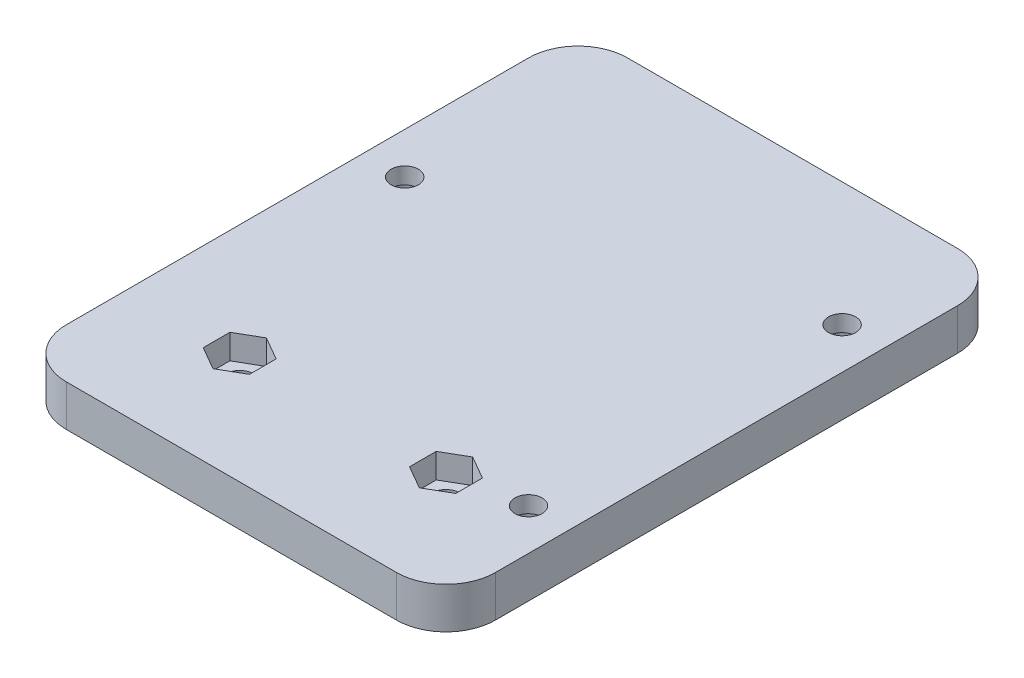
ISO-10303-21;
HEADER;
FILE_DESCRIPTION(('STEP AP214'),'2;1');
FILE_NAME('part.step','',(''),(''),'','','');
FILE_SCHEMA(('AUTOMOTIVE_DESIGN { 1 0 10303 214 1 1 1 1 }'));
ENDSEC;
DATA;
#1=APPLICATION_CONTEXT('core data for automotive mechanical design processes');
#2=APPLICATION_PROTOCOL_DEFINITION('international standard','automotive_design',2000,#1);
#3=PRODUCT_CONTEXT('',#1,'mechanical');
#4=PRODUCT('Part','Part','',(#3));
#5=PRODUCT_RELATED_PRODUCT_CATEGORY('part','',(#4));
#6=PRODUCT_DEFINITION_FORMATION('','',#4);
#7=PRODUCT_DEFINITION_CONTEXT('part definition',#1,'design');
#8=PRODUCT_DEFINITION('design','',#6,#7);
#9=PRODUCT_DEFINITION_SHAPE('','',#8);
#10=(LENGTH_UNIT() NAMED_UNIT(*) SI_UNIT(.MILLI.,.METRE.));
#11=(NAMED_UNIT(*) PLANE_ANGLE_UNIT() SI_UNIT($,.RADIAN.));
#12=(NAMED_UNIT(*) SI_UNIT($,.STERADIAN.) SOLID_ANGLE_UNIT());
#13=UNCERTAINTY_MEASURE_WITH_UNIT(LENGTH_MEASURE(1.E-05),#10,'distance_accuracy_value','');
#14=(GEOMETRIC_REPRESENTATION_CONTEXT(3) GLOBAL_UNCERTAINTY_ASSIGNED_CONTEXT((#13)) GLOBAL_UNIT_ASSIGNED_CONTEXT((#10,
#11,#12)) REPRESENTATION_CONTEXT('',''));
#15=CARTESIAN_POINT('',(0.,0.,0.));
#16=DIRECTION('',(0.,0.,1.));
#17=DIRECTION('',(1.,0.,0.));
#18=AXIS2_PLACEMENT_3D('',#15,#16,#17);
#19=CARTESIAN_POINT('',(10.5,-74.498,190.));
#20=DIRECTION('',(0.,-1.,0.));
#21=DIRECTION('',(0.,0.,-1.));
#22=AXIS2_PLACEMENT_3D('',#19,#20,#21);
#23=CYLINDRICAL_SURFACE('',#22,1.65);
#24=CARTESIAN_POINT('',(10.5,-89.5,190.));
#25=DIRECTION('',(0.,-1.,0.));
#26=DIRECTION('',(0.,0.,-1.));
#27=AXIS2_PLACEMENT_3D('',#24,#25,#26);
#28=CIRCLE('',#27,1.65);
#29=CARTESIAN_POINT('',(10.5,-89.5,188.35));
#30=VERTEX_POINT('',#29);
#31=EDGE_CURVE('E427',#30,#30,#28,.T.);
#32=ORIENTED_EDGE('',*,*,#31,.F.);
#33=EDGE_LOOP('',(#32));
#34=FACE_BOUND('',#33,.T.);
#35=CARTESIAN_POINT('',(10.5,-91.5,190.));
#36=DIRECTION('',(0.,-1.,0.));
#37=DIRECTION('',(0.,0.,-1.));
#38=AXIS2_PLACEMENT_3D('',#35,#36,#37);
#39=CIRCLE('',#38,1.65);
#40=CARTESIAN_POINT('',(10.5,-91.5,188.35));
#41=VERTEX_POINT('',#40);
#42=EDGE_CURVE('E478',#41,#41,#39,.T.);
#43=ORIENTED_EDGE('',*,*,#42,.T.);
#44=EDGE_LOOP('',(#43));
#45=FACE_BOUND('',#44,.T.);
#46=ADVANCED_FACE('F16',(#34,#45),#23,.F.);
#47=CARTESIAN_POINT('',(10.5,-74.498,152.));
#48=DIRECTION('',(0.,-1.,0.));
#49=DIRECTION('',(0.,0.,-1.));
#50=AXIS2_PLACEMENT_3D('',#47,#48,#49);
#51=CYLINDRICAL_SURFACE('',#50,1.65);
#52=CARTESIAN_POINT('',(10.5,-89.5,152.));
#53=DIRECTION('',(0.,-1.,0.));
#54=DIRECTION('',(0.,0.,-1.));
#55=AXIS2_PLACEMENT_3D('',#52,#53,#54);
#56=CIRCLE('',#55,1.65);
#57=CARTESIAN_POINT('',(10.5,-89.5,150.35));
#58=VERTEX_POINT('',#57);
#59=EDGE_CURVE('E430',#58,#58,#56,.T.);
#60=ORIENTED_EDGE('',*,*,#59,.F.);
#61=EDGE_LOOP('',(#60));
#62=FACE_BOUND('',#61,.T.);
#63=CARTESIAN_POINT('',(10.5,-91.5,152.));
#64=DIRECTION('',(0.,-1.,0.));
#65=DIRECTION('',(0.,0.,-1.));
#66=AXIS2_PLACEMENT_3D('',#63,#64,#65);
#67=CIRCLE('',#66,1.65);
#68=CARTESIAN_POINT('',(10.5,-91.5,150.35));
#69=VERTEX_POINT('',#68);
#70=EDGE_CURVE('E468',#69,#69,#67,.T.);
#71=ORIENTED_EDGE('',*,*,#70,.T.);
#72=EDGE_LOOP('',(#71));
#73=FACE_BOUND('',#72,.T.);
#74=ADVANCED_FACE('F449',(#62,#73),#51,.F.);
#75=CARTESIAN_POINT('',(-31.5,-74.498,163.));
#76=DIRECTION('',(0.,-1.,0.));
#77=DIRECTION('',(0.,0.,-1.));
#78=AXIS2_PLACEMENT_3D('',#75,#76,#77);
#79=CYLINDRICAL_SURFACE('',#78,1.65);
#80=CARTESIAN_POINT('',(-31.5,-89.5,163.));
#81=DIRECTION('',(0.,-1.,0.));
#82=DIRECTION('',(0.,0.,-1.));
#83=AXIS2_PLACEMENT_3D('',#80,#81,#82);
#84=CIRCLE('',#83,1.65);
#85=CARTESIAN_POINT('',(-31.5,-89.5,161.35));
#86=VERTEX_POINT('',#85);
#87=EDGE_CURVE('E20',#86,#86,#84,.T.);
#88=ORIENTED_EDGE('',*,*,#87,.F.);
#89=EDGE_LOOP('',(#88));
#90=FACE_BOUND('',#89,.T.);
#91=CARTESIAN_POINT('',(-31.5,-91.5,163.));
#92=DIRECTION('',(0.,-1.,0.));
#93=DIRECTION('',(0.,0.,-1.));
#94=AXIS2_PLACEMENT_3D('',#91,#92,#93);
#95=CIRCLE('',#94,1.65);
#96=CARTESIAN_POINT('',(-31.5,-91.5,161.35));
#97=VERTEX_POINT('',#96);
#98=EDGE_CURVE('E431',#97,#97,#95,.T.);
#99=ORIENTED_EDGE('',*,*,#98,.T.);
#100=EDGE_LOOP('',(#99));
#101=FACE_BOUND('',#100,.T.);
#102=ADVANCED_FACE('F445',(#90,#101),#79,.F.);
#103=CARTESIAN_POINT('',(2.,-89.498,191.5));
#104=DIRECTION('',(0.,-1.,0.));
#105=DIRECTION('',(0.,0.,-1.));
#106=AXIS2_PLACEMENT_3D('',#103,#104,#105);
#107=CYLINDRICAL_SURFACE('',#106,1.7);
#108=CARTESIAN_POINT('',(2.,-94.5,191.5));
#109=DIRECTION('',(0.,-1.,0.));
#110=DIRECTION('',(0.,0.,-1.));
#111=AXIS2_PLACEMENT_3D('',#108,#109,#110);
#112=CIRCLE('',#111,1.7);
#113=CARTESIAN_POINT('',(2.,-94.5,189.8));
#114=VERTEX_POINT('',#113);
#115=EDGE_CURVE('E263',#114,#114,#112,.T.);
#116=ORIENTED_EDGE('',*,*,#115,.T.);
#117=EDGE_LOOP('',(#116));
#118=FACE_BOUND('',#117,.T.);
#119=CARTESIAN_POINT('',(2.,-92.5,191.5));
#120=DIRECTION('',(0.,-1.,0.));
#121=DIRECTION('',(0.,0.,-1.));
#122=AXIS2_PLACEMENT_3D('',#119,#120,#121);
#123=CIRCLE('',#122,1.7);
#124=CARTESIAN_POINT('',(2.,-92.5,189.8));
#125=VERTEX_POINT('',#124);
#126=EDGE_CURVE('E212',#125,#125,#123,.F.);
#127=ORIENTED_EDGE('',*,*,#126,.T.);
#128=EDGE_LOOP('',(#127));
#129=FACE_BOUND('',#128,.T.);
#130=ADVANCED_FACE('F448',(#118,#129),#107,.F.);
#131=CARTESIAN_POINT('',(-23.,-89.498,191.5));
#132=DIRECTION('',(0.,-1.,0.));
#133=DIRECTION('',(0.,0.,-1.));
#134=AXIS2_PLACEMENT_3D('',#131,#132,#133);
#135=CYLINDRICAL_SURFACE('',#134,1.7);
#136=CARTESIAN_POINT('',(-23.,-94.5,191.5));
#137=DIRECTION('',(0.,-1.,0.));
#138=DIRECTION('',(0.,0.,-1.));
#139=AXIS2_PLACEMENT_3D('',#136,#137,#138);
#140=CIRCLE('',#139,1.7);
#141=CARTESIAN_POINT('',(-23.,-94.5,189.8));
#142=VERTEX_POINT('',#141);
#143=EDGE_CURVE('E344',#142,#142,#140,.T.);
#144=ORIENTED_EDGE('',*,*,#143,.T.);
#145=EDGE_LOOP('',(#144));
#146=FACE_BOUND('',#145,.T.);
#147=CARTESIAN_POINT('',(-23.,-92.5,191.5));
#148=DIRECTION('',(0.,-1.,0.));
#149=DIRECTION('',(0.,0.,-1.));
#150=AXIS2_PLACEMENT_3D('',#147,#148,#149);
#151=CIRCLE('',#150,1.7);
#152=CARTESIAN_POINT('',(-23.,-92.5,189.8));
#153=VERTEX_POINT('',#152);
#154=EDGE_CURVE('E275',#153,#153,#151,.F.);
#155=ORIENTED_EDGE('',*,*,#154,.T.);
#156=EDGE_LOOP('',(#155));
#157=FACE_BOUND('',#156,.T.);
#158=ADVANCED_FACE('F572',(#146,#157),#135,.F.);
#159=CARTESIAN_POINT('',(-30.5,-94.5,143.));
#160=DIRECTION('',(0.,1.,0.));
#161=DIRECTION('',(0.,0.,1.));
#162=AXIS2_PLACEMENT_3D('',#159,#160,#161);
#163=CYLINDRICAL_SURFACE('',#162,6.);
#164=CARTESIAN_POINT('',(-30.5,-89.5,143.));
#165=DIRECTION('',(0.,-1.,0.));
#166=DIRECTION('',(0.,0.,-1.));
#167=AXIS2_PLACEMENT_3D('',#164,#165,#166);
#168=CIRCLE('',#167,6.);
#169=CARTESIAN_POINT('',(-36.5,-89.5,143.));
#170=VERTEX_POINT('',#169);
#171=CARTESIAN_POINT('',(-30.5,-89.5,137.));
#172=VERTEX_POINT('',#171);
#173=EDGE_CURVE('E348',#170,#172,#168,.T.);
#174=ORIENTED_EDGE('',*,*,#173,.T.);
#175=DIRECTION('',(0.,1.,0.));
#176=VECTOR('',#175,1.);
#177=CARTESIAN_POINT('',(-30.5,-94.5,137.));
#178=LINE('',#177,#176);
#179=CARTESIAN_POINT('',(-30.5,-94.5,137.));
#180=VERTEX_POINT('',#179);
#181=EDGE_CURVE('E10',#180,#172,#178,.T.);
#182=ORIENTED_EDGE('',*,*,#181,.F.);
#183=CARTESIAN_POINT('',(-30.5,-94.5,143.));
#184=DIRECTION('',(0.,-1.,0.));
#185=DIRECTION('',(0.,0.,-1.));
#186=AXIS2_PLACEMENT_3D('',#183,#184,#185);
#187=CIRCLE('',#186,6.);
#188=CARTESIAN_POINT('',(-36.5,-94.5,143.));
#189=VERTEX_POINT('',#188);
#190=EDGE_CURVE('E349',#189,#180,#187,.T.);
#191=ORIENTED_EDGE('',*,*,#190,.F.);
#192=DIRECTION('',(0.,1.,0.));
#193=VECTOR('',#192,1.);
#194=CARTESIAN_POINT('',(-36.5,-94.5,143.));
#195=LINE('',#194,#193);
#196=EDGE_CURVE('E377',#189,#170,#195,.T.);
#197=ORIENTED_EDGE('',*,*,#196,.T.);
#198=EDGE_LOOP('',(#174,#182,#191,#197));
#199=FACE_BOUND('',#198,.T.);
#200=ADVANCED_FACE('F18',(#199),#163,.T.);
#201=CARTESIAN_POINT('',(-23.,-94.5,137.));
#202=DIRECTION('',(0.,0.,1.));
#203=DIRECTION('',(1.,0.,0.));
#204=AXIS2_PLACEMENT_3D('',#201,#202,#203);
#205=PLANE('',#204);
#206=DIRECTION('',(1.,0.,0.));
#207=VECTOR('',#206,1.);
#208=CARTESIAN_POINT('',(-23.,-89.5,137.));
#209=LINE('',#208,#207);
#210=CARTESIAN_POINT('',(9.5,-89.5,137.));
#211=VERTEX_POINT('',#210);
#212=EDGE_CURVE('E381',#172,#211,#209,.T.);
#213=ORIENTED_EDGE('',*,*,#212,.T.);
#214=DIRECTION('',(0.,1.,0.));
#215=VECTOR('',#214,1.);
#216=CARTESIAN_POINT('',(9.5,-94.5,137.));
#217=LINE('',#216,#215);
#218=CARTESIAN_POINT('',(9.5,-94.5,137.));
#219=VERTEX_POINT('',#218);
#220=EDGE_CURVE('E26',#219,#211,#217,.T.);
#221=ORIENTED_EDGE('',*,*,#220,.F.);
#222=DIRECTION('',(1.,0.,0.));
#223=VECTOR('',#222,1.);
#224=CARTESIAN_POINT('',(-23.,-94.5,137.));
#225=LINE('',#224,#223);
#226=EDGE_CURVE('E353',#180,#219,#225,.T.);
#227=ORIENTED_EDGE('',*,*,#226,.F.);
#228=ORIENTED_EDGE('',*,*,#181,.T.);
#229=EDGE_LOOP('',(#213,#221,#227,#228));
#230=FACE_BOUND('',#229,.T.);
#231=ADVANCED_FACE('F607',(#230),#205,.F.);
#232=CARTESIAN_POINT('',(9.5,-94.5,143.));
#233=DIRECTION('',(0.,1.,0.));
#234=DIRECTION('',(0.,0.,1.));
#235=AXIS2_PLACEMENT_3D('',#232,#233,#234);
#236=CYLINDRICAL_SURFACE('',#235,6.);
#237=CARTESIAN_POINT('',(9.5,-89.5,143.));
#238=DIRECTION('',(0.,-1.,0.));
#239=DIRECTION('',(0.,0.,-1.));
#240=AXIS2_PLACEMENT_3D('',#237,#238,#239);
#241=CIRCLE('',#240,6.);
#242=CARTESIAN_POINT('',(15.5,-89.5,143.));
#243=VERTEX_POINT('',#242);
#244=EDGE_CURVE('E384',#211,#243,#241,.T.);
#245=ORIENTED_EDGE('',*,*,#244,.T.);
#246=DIRECTION('',(0.,1.,0.));
#247=VECTOR('',#246,1.);
#248=CARTESIAN_POINT('',(15.5,-94.5,143.));
#249=LINE('',#248,#247);
#250=CARTESIAN_POINT('',(15.5,-94.5,143.));
#251=VERTEX_POINT('',#250);
#252=EDGE_CURVE('E421',#251,#243,#249,.T.);
#253=ORIENTED_EDGE('',*,*,#252,.F.);
#254=CARTESIAN_POINT('',(9.5,-94.5,143.));
#255=DIRECTION('',(0.,-1.,0.));
#256=DIRECTION('',(0.,0.,-1.));
#257=AXIS2_PLACEMENT_3D('',#254,#255,#256);
#258=CIRCLE('',#257,6.);
#259=EDGE_CURVE('E357',#219,#251,#258,.T.);
#260=ORIENTED_EDGE('',*,*,#259,.F.);
#261=ORIENTED_EDGE('',*,*,#220,.T.);
#262=EDGE_LOOP('',(#245,#253,#260,#261));
#263=FACE_BOUND('',#262,.T.);
#264=ADVANCED_FACE('F604',(#263),#236,.T.);
#265=CARTESIAN_POINT('',(15.5,-94.5,171.));
#266=DIRECTION('',(1.,0.,0.));
#267=DIRECTION('',(0.,0.,-1.));
#268=AXIS2_PLACEMENT_3D('',#265,#266,#267);
#269=PLANE('',#268);
#270=DIRECTION('',(0.,0.,-1.));
#271=VECTOR('',#270,1.);
#272=CARTESIAN_POINT('',(15.5,-89.5,171.));
#273=LINE('',#272,#271);
#274=CARTESIAN_POINT('',(15.5,-89.5,199.));
#275=VERTEX_POINT('',#274);
#276=EDGE_CURVE('E388',#275,#243,#273,.T.);
#277=ORIENTED_EDGE('',*,*,#276,.F.);
#278=DIRECTION('',(0.,1.,0.));
#279=VECTOR('',#278,1.);
#280=CARTESIAN_POINT('',(15.5,-94.5,199.));
#281=LINE('',#280,#279);
#282=CARTESIAN_POINT('',(15.5,-94.5,199.));
#283=VERTEX_POINT('',#282);
#284=EDGE_CURVE('E418',#283,#275,#281,.T.);
#285=ORIENTED_EDGE('',*,*,#284,.F.);
#286=DIRECTION('',(0.,0.,-1.));
#287=VECTOR('',#286,1.);
#288=CARTESIAN_POINT('',(15.5,-94.5,171.));
#289=LINE('',#288,#287);
#290=EDGE_CURVE('E360',#283,#251,#289,.T.);
#291=ORIENTED_EDGE('',*,*,#290,.T.);
#292=ORIENTED_EDGE('',*,*,#252,.T.);
#293=EDGE_LOOP('',(#277,#285,#291,#292));
#294=FACE_BOUND('',#293,.T.);
#295=ADVANCED_FACE('F600',(#294),#269,.T.);
#296=CARTESIAN_POINT('',(9.5,-94.5,199.));
#297=DIRECTION('',(0.,1.,0.));
#298=DIRECTION('',(0.,0.,1.));
#299=AXIS2_PLACEMENT_3D('',#296,#297,#298);
#300=CYLINDRICAL_SURFACE('',#299,6.);
#301=CARTESIAN_POINT('',(9.5,-89.5,199.));
#302=DIRECTION('',(0.,-1.,0.));
#303=DIRECTION('',(0.,0.,-1.));
#304=AXIS2_PLACEMENT_3D('',#301,#302,#303);
#305=CIRCLE('',#304,6.);
#306=CARTESIAN_POINT('',(9.5,-89.5,205.));
#307=VERTEX_POINT('',#306);
#308=EDGE_CURVE('E392',#275,#307,#305,.T.);
#309=ORIENTED_EDGE('',*,*,#308,.T.);
#310=DIRECTION('',(0.,1.,0.));
#311=VECTOR('',#310,1.);
#312=CARTESIAN_POINT('',(9.5,-94.5,205.));
#313=LINE('',#312,#311);
#314=CARTESIAN_POINT('',(9.5,-94.5,205.));
#315=VERTEX_POINT('',#314);
#316=EDGE_CURVE('E415',#315,#307,#313,.T.);
#317=ORIENTED_EDGE('',*,*,#316,.F.);
#318=CARTESIAN_POINT('',(9.5,-94.5,199.));
#319=DIRECTION('',(0.,-1.,0.));
#320=DIRECTION('',(0.,0.,-1.));
#321=AXIS2_PLACEMENT_3D('',#318,#319,#320);
#322=CIRCLE('',#321,6.);
#323=EDGE_CURVE('E364',#283,#315,#322,.T.);
#324=ORIENTED_EDGE('',*,*,#323,.F.);
#325=ORIENTED_EDGE('',*,*,#284,.T.);
#326=EDGE_LOOP('',(#309,#317,#324,#325));
#327=FACE_BOUND('',#326,.T.);
#328=ADVANCED_FACE('F596',(#327),#300,.T.);
#329=CARTESIAN_POINT('',(-23.,-94.5,205.));
#330=DIRECTION('',(0.,0.,1.));
#331=DIRECTION('',(1.,0.,0.));
#332=AXIS2_PLACEMENT_3D('',#329,#330,#331);
#333=PLANE('',#332);
#334=DIRECTION('',(1.,0.,0.));
#335=VECTOR('',#334,1.);
#336=CARTESIAN_POINT('',(-23.,-89.5,205.));
#337=LINE('',#336,#335);
#338=CARTESIAN_POINT('',(-30.5,-89.5,205.));
#339=VERTEX_POINT('',#338);
#340=EDGE_CURVE('E396',#339,#307,#337,.T.);
#341=ORIENTED_EDGE('',*,*,#340,.F.);
#342=DIRECTION('',(0.,1.,0.));
#343=VECTOR('',#342,1.);
#344=CARTESIAN_POINT('',(-30.5,-94.5,205.));
#345=LINE('',#344,#343);
#346=CARTESIAN_POINT('',(-30.5,-94.5,205.));
#347=VERTEX_POINT('',#346);
#348=EDGE_CURVE('E412',#347,#339,#345,.T.);
#349=ORIENTED_EDGE('',*,*,#348,.F.);
#350=DIRECTION('',(1.,0.,0.));
#351=VECTOR('',#350,1.);
#352=CARTESIAN_POINT('',(-23.,-94.5,205.));
#353=LINE('',#352,#351);
#354=EDGE_CURVE('E367',#347,#315,#353,.T.);
#355=ORIENTED_EDGE('',*,*,#354,.T.);
#356=ORIENTED_EDGE('',*,*,#316,.T.);
#357=EDGE_LOOP('',(#341,#349,#355,#356));
#358=FACE_BOUND('',#357,.T.);
#359=ADVANCED_FACE('F592',(#358),#333,.T.);
#360=CARTESIAN_POINT('',(-30.5,-94.5,199.));
#361=DIRECTION('',(0.,1.,0.));
#362=DIRECTION('',(0.,0.,1.));
#363=AXIS2_PLACEMENT_3D('',#360,#361,#362);
#364=CYLINDRICAL_SURFACE('',#363,6.);
#365=CARTESIAN_POINT('',(-30.5,-89.5,199.));
#366=DIRECTION('',(0.,-1.,0.));
#367=DIRECTION('',(0.,0.,-1.));
#368=AXIS2_PLACEMENT_3D('',#365,#366,#367);
#369=CIRCLE('',#368,6.);
#370=CARTESIAN_POINT('',(-36.5,-89.5,199.));
#371=VERTEX_POINT('',#370);
#372=EDGE_CURVE('E400',#339,#371,#369,.T.);
#373=ORIENTED_EDGE('',*,*,#372,.T.);
#374=DIRECTION('',(0.,1.,0.));
#375=VECTOR('',#374,1.);
#376=CARTESIAN_POINT('',(-36.5,-94.5,199.));
#377=LINE('',#376,#375);
#378=CARTESIAN_POINT('',(-36.5,-94.5,199.));
#379=VERTEX_POINT('',#378);
#380=EDGE_CURVE('E408',#379,#371,#377,.T.);
#381=ORIENTED_EDGE('',*,*,#380,.F.);
#382=CARTESIAN_POINT('',(-30.5,-94.5,199.));
#383=DIRECTION('',(0.,-1.,0.));
#384=DIRECTION('',(0.,0.,-1.));
#385=AXIS2_PLACEMENT_3D('',#382,#383,#384);
#386=CIRCLE('',#385,6.);
#387=EDGE_CURVE('E371',#347,#379,#386,.T.);
#388=ORIENTED_EDGE('',*,*,#387,.F.);
#389=ORIENTED_EDGE('',*,*,#348,.T.);
#390=EDGE_LOOP('',(#373,#381,#388,#389));
#391=FACE_BOUND('',#390,.T.);
#392=ADVANCED_FACE('F588',(#391),#364,.T.);
#393=CARTESIAN_POINT('',(-36.5,-94.5,171.));
#394=DIRECTION('',(1.,0.,0.));
#395=DIRECTION('',(0.,0.,-1.));
#396=AXIS2_PLACEMENT_3D('',#393,#394,#395);
#397=PLANE('',#396);
#398=DIRECTION('',(0.,0.,-1.));
#399=VECTOR('',#398,1.);
#400=CARTESIAN_POINT('',(-36.5,-89.5,171.));
#401=LINE('',#400,#399);
#402=EDGE_CURVE('E354',#371,#170,#401,.T.);
#403=ORIENTED_EDGE('',*,*,#402,.T.);
#404=ORIENTED_EDGE('',*,*,#196,.F.);
#405=DIRECTION('',(0.,0.,-1.));
#406=VECTOR('',#405,1.);
#407=CARTESIAN_POINT('',(-36.5,-94.5,171.));
#408=LINE('',#407,#406);
#409=EDGE_CURVE('E374',#379,#189,#408,.T.);
#410=ORIENTED_EDGE('',*,*,#409,.F.);
#411=ORIENTED_EDGE('',*,*,#380,.T.);
#412=EDGE_LOOP('',(#403,#404,#410,#411));
#413=FACE_BOUND('',#412,.T.);
#414=ADVANCED_FACE('F582',(#413),#397,.F.);
#415=CARTESIAN_POINT('',(-10.5,-94.5,171.));
#416=DIRECTION('',(0.,-1.,0.));
#417=DIRECTION('',(1.,0.,0.));
#418=AXIS2_PLACEMENT_3D('',#415,#416,#417);
#419=PLANE('',#418);
#420=CARTESIAN_POINT('',(-31.5,-94.5,163.));
#421=DIRECTION('',(0.,-1.,0.));
#422=DIRECTION('',(0.,0.,-1.));
#423=AXIS2_PLACEMENT_3D('',#420,#421,#422);
#424=CIRCLE('',#423,2.75);
#425=CARTESIAN_POINT('',(-31.5,-94.5,160.25));
#426=VERTEX_POINT('',#425);
#427=EDGE_CURVE('E462',#426,#426,#424,.T.);
#428=ORIENTED_EDGE('',*,*,#427,.F.);
#429=EDGE_LOOP('',(#428));
#430=FACE_BOUND('',#429,.T.);
#431=CARTESIAN_POINT('',(10.5,-94.5,152.));
#432=DIRECTION('',(0.,-1.,0.));
#433=DIRECTION('',(0.,0.,-1.));
#434=AXIS2_PLACEMENT_3D('',#431,#432,#433);
#435=CIRCLE('',#434,2.75);
#436=CARTESIAN_POINT('',(10.5,-94.5,149.25));
#437=VERTEX_POINT('',#436);
#438=EDGE_CURVE('E471',#437,#437,#435,.T.);
#439=ORIENTED_EDGE('',*,*,#438,.F.);
#440=EDGE_LOOP('',(#439));
#441=FACE_BOUND('',#440,.T.);
#442=CARTESIAN_POINT('',(10.5,-94.5,190.));
#443=DIRECTION('',(0.,-1.,0.));
#444=DIRECTION('',(0.,0.,-1.));
#445=AXIS2_PLACEMENT_3D('',#442,#443,#444);
#446=CIRCLE('',#445,2.75);
#447=CARTESIAN_POINT('',(10.5,-94.5,187.25));
#448=VERTEX_POINT('',#447);
#449=EDGE_CURVE('E483',#448,#448,#446,.T.);
#450=ORIENTED_EDGE('',*,*,#449,.F.);
#451=EDGE_LOOP('',(#450));
#452=FACE_BOUND('',#451,.T.);
#453=ORIENTED_EDGE('',*,*,#143,.F.);
#454=EDGE_LOOP('',(#453));
#455=FACE_BOUND('',#454,.T.);
#456=ORIENTED_EDGE('',*,*,#115,.F.);
#457=EDGE_LOOP('',(#456));
#458=FACE_BOUND('',#457,.T.);
#459=ORIENTED_EDGE('',*,*,#190,.T.);
#460=ORIENTED_EDGE('',*,*,#226,.T.);
#461=ORIENTED_EDGE('',*,*,#259,.T.);
#462=ORIENTED_EDGE('',*,*,#290,.F.);
#463=ORIENTED_EDGE('',*,*,#323,.T.);
#464=ORIENTED_EDGE('',*,*,#354,.F.);
#465=ORIENTED_EDGE('',*,*,#387,.T.);
#466=ORIENTED_EDGE('',*,*,#409,.T.);
#467=EDGE_LOOP('',(#459,#460,#461,#462,#463,#464,#465,#466));
#468=FACE_BOUND('',#467,.T.);
#469=ADVANCED_FACE('F579',(#430,#441,#452,#455,#458,#468),#419,.T.);
#470=CARTESIAN_POINT('',(-10.5,-89.5,171.));
#471=DIRECTION('',(0.,-1.,0.));
#472=DIRECTION('',(1.,0.,0.));
#473=AXIS2_PLACEMENT_3D('',#470,#471,#472);
#474=PLANE('',#473);
#475=ORIENTED_EDGE('',*,*,#87,.T.);
#476=EDGE_LOOP('',(#475));
#477=FACE_BOUND('',#476,.T.);
#478=ORIENTED_EDGE('',*,*,#59,.T.);
#479=EDGE_LOOP('',(#478));
#480=FACE_BOUND('',#479,.T.);
#481=ORIENTED_EDGE('',*,*,#31,.T.);
#482=EDGE_LOOP('',(#481));
#483=FACE_BOUND('',#482,.T.);
#484=DIRECTION('',(0.866025403784439,0.,-0.5));
#485=VECTOR('',#484,1.);
#486=CARTESIAN_POINT('',(3.4,-89.5,193.924871130597));
#487=LINE('',#486,#485);
#488=CARTESIAN_POINT('',(1.99999999999995,-89.5,194.733161507462));
#489=VERTEX_POINT('',#488);
#490=CARTESIAN_POINT('',(4.8,-89.5,193.116580753731));
#491=VERTEX_POINT('',#490);
#492=EDGE_CURVE('E256',#489,#491,#487,.T.);
#493=ORIENTED_EDGE('',*,*,#492,.F.);
#494=DIRECTION('',(0.866025403784439,0.,0.5));
#495=VECTOR('',#494,1.);
#496=CARTESIAN_POINT('',(0.599999999999979,-89.5,193.924871130597));
#497=LINE('',#496,#495);
#498=CARTESIAN_POINT('',(-0.8,-89.5,193.116580753731));
#499=VERTEX_POINT('',#498);
#500=EDGE_CURVE('E224',#499,#489,#497,.T.);
#501=ORIENTED_EDGE('',*,*,#500,.F.);
#502=DIRECTION('',(0.,0.,1.));
#503=VECTOR('',#502,1.);
#504=CARTESIAN_POINT('',(-0.800000000000013,-89.5,191.5));
#505=LINE('',#504,#503);
#506=CARTESIAN_POINT('',(-0.800000000000014,-89.5,189.883419246269));
#507=VERTEX_POINT('',#506);
#508=EDGE_CURVE('E205',#507,#499,#505,.T.);
#509=ORIENTED_EDGE('',*,*,#508,.F.);
#510=DIRECTION('',(-0.86602540378444,0.,0.5));
#511=VECTOR('',#510,1.);
#512=CARTESIAN_POINT('',(0.599999999999987,-89.5,189.075128869403));
#513=LINE('',#512,#511);
#514=CARTESIAN_POINT('',(2.,-89.5,188.266838492538));
#515=VERTEX_POINT('',#514);
#516=EDGE_CURVE('E39',#515,#507,#513,.T.);
#517=ORIENTED_EDGE('',*,*,#516,.F.);
#518=DIRECTION('',(-0.86602540378444,0.,-0.5));
#519=VECTOR('',#518,1.);
#520=CARTESIAN_POINT('',(3.4,-89.5,189.075128869403));
#521=LINE('',#520,#519);
#522=CARTESIAN_POINT('',(4.8,-89.5,189.883419246269));
#523=VERTEX_POINT('',#522);
#524=EDGE_CURVE('E248',#523,#515,#521,.T.);
#525=ORIENTED_EDGE('',*,*,#524,.F.);
#526=DIRECTION('',(0.,0.,-1.));
#527=VECTOR('',#526,1.);
#528=CARTESIAN_POINT('',(4.8,-89.5,191.5));
#529=LINE('',#528,#527);
#530=EDGE_CURVE('E252',#491,#523,#529,.T.);
#531=ORIENTED_EDGE('',*,*,#530,.F.);
#532=EDGE_LOOP('',(#493,#501,#509,#517,#525,#531));
#533=FACE_BOUND('',#532,.T.);
#534=DIRECTION('',(0.866025403784437,0.,-0.5));
#535=VECTOR('',#534,1.);
#536=CARTESIAN_POINT('',(-21.6,-89.5,193.924871130597));
#537=LINE('',#536,#535);
#538=CARTESIAN_POINT('',(-23.,-89.5,194.733161507462));
#539=VERTEX_POINT('',#538);
#540=CARTESIAN_POINT('',(-20.2,-89.5,193.116580753731));
#541=VERTEX_POINT('',#540);
#542=EDGE_CURVE('E309',#539,#541,#537,.T.);
#543=ORIENTED_EDGE('',*,*,#542,.F.);
#544=DIRECTION('',(0.86602540378444,0.,0.5));
#545=VECTOR('',#544,1.);
#546=CARTESIAN_POINT('',(-24.4,-89.5,193.924871130597));
#547=LINE('',#546,#545);
#548=CARTESIAN_POINT('',(-25.8,-89.5,193.116580753731));
#549=VERTEX_POINT('',#548);
#550=EDGE_CURVE('E305',#549,#539,#547,.T.);
#551=ORIENTED_EDGE('',*,*,#550,.F.);
#552=DIRECTION('',(0.,0.,1.));
#553=VECTOR('',#552,1.);
#554=CARTESIAN_POINT('',(-25.8,-89.5,191.5));
#555=LINE('',#554,#553);
#556=CARTESIAN_POINT('',(-25.8,-89.5,189.883419246269));
#557=VERTEX_POINT('',#556);
#558=EDGE_CURVE('E280',#557,#549,#555,.T.);
#559=ORIENTED_EDGE('',*,*,#558,.F.);
#560=DIRECTION('',(-0.866025403784437,0.,0.5));
#561=VECTOR('',#560,1.);
#562=CARTESIAN_POINT('',(-24.4,-89.5,189.075128869403));
#563=LINE('',#562,#561);
#564=CARTESIAN_POINT('',(-23.,-89.5,188.266838492538));
#565=VERTEX_POINT('',#564);
#566=EDGE_CURVE('E51',#565,#557,#563,.T.);
#567=ORIENTED_EDGE('',*,*,#566,.F.);
#568=DIRECTION('',(-0.866025403784439,0.,-0.5));
#569=VECTOR('',#568,1.);
#570=CARTESIAN_POINT('',(-21.6,-89.5,189.075128869403));
#571=LINE('',#570,#569);
#572=CARTESIAN_POINT('',(-20.2,-89.5,189.883419246269));
#573=VERTEX_POINT('',#572);
#574=EDGE_CURVE('E316',#573,#565,#571,.T.);
#575=ORIENTED_EDGE('',*,*,#574,.F.);
#576=DIRECTION('',(0.,0.,-1.));
#577=VECTOR('',#576,1.);
#578=CARTESIAN_POINT('',(-20.2,-89.5,191.5));
#579=LINE('',#578,#577);
#580=EDGE_CURVE('E312',#541,#573,#579,.T.);
#581=ORIENTED_EDGE('',*,*,#580,.F.);
#582=EDGE_LOOP('',(#543,#551,#559,#567,#575,#581));
#583=FACE_BOUND('',#582,.T.);
#584=ORIENTED_EDGE('',*,*,#173,.F.);
#585=ORIENTED_EDGE('',*,*,#402,.F.);
#586=ORIENTED_EDGE('',*,*,#372,.F.);
#587=ORIENTED_EDGE('',*,*,#340,.T.);
#588=ORIENTED_EDGE('',*,*,#308,.F.);
#589=ORIENTED_EDGE('',*,*,#276,.T.);
#590=ORIENTED_EDGE('',*,*,#244,.F.);
#591=ORIENTED_EDGE('',*,*,#212,.F.);
#592=EDGE_LOOP('',(#584,#585,#586,#587,#588,#589,#590,#591));
#593=FACE_BOUND('',#592,.T.);
#594=ADVANCED_FACE('F443',(#477,#480,#483,#533,#583,#593),#474,.F.);
#595=CARTESIAN_POINT('',(-24.4,-92.5,193.924871130597));
#596=DIRECTION('',(-0.5,0.,0.86602540378444));
#597=DIRECTION('',(0.86602540378444,0.,0.5));
#598=AXIS2_PLACEMENT_3D('',#595,#596,#597);
#599=PLANE('',#598);
#600=ORIENTED_EDGE('',*,*,#550,.T.);
#601=DIRECTION('',(0.,1.,0.));
#602=VECTOR('',#601,1.);
#603=CARTESIAN_POINT('',(-23.,-92.5,194.733161507462));
#604=LINE('',#603,#602);
#605=CARTESIAN_POINT('',(-23.,-92.5,194.733161507462));
#606=VERTEX_POINT('',#605);
#607=EDGE_CURVE('E245',#606,#539,#604,.T.);
#608=ORIENTED_EDGE('',*,*,#607,.F.);
#609=DIRECTION('',(0.86602540378444,0.,0.5));
#610=VECTOR('',#609,1.);
#611=CARTESIAN_POINT('',(-24.4,-92.5,193.924871130597));
#612=LINE('',#611,#610);
#613=CARTESIAN_POINT('',(-25.8,-92.5,193.116580753731));
#614=VERTEX_POINT('',#613);
#615=EDGE_CURVE('E279',#614,#606,#612,.T.);
#616=ORIENTED_EDGE('',*,*,#615,.F.);
#617=DIRECTION('',(0.,1.,0.));
#618=VECTOR('',#617,1.);
#619=CARTESIAN_POINT('',(-25.8,-92.5,193.116580753731));
#620=LINE('',#619,#618);
#621=EDGE_CURVE('E304',#614,#549,#620,.T.);
#622=ORIENTED_EDGE('',*,*,#621,.T.);
#623=EDGE_LOOP('',(#600,#608,#616,#622));
#624=FACE_BOUND('',#623,.T.);
#625=ADVANCED_FACE('F567',(#624),#599,.F.);
#626=CARTESIAN_POINT('',(-21.6,-92.5,193.924871130597));
#627=DIRECTION('',(0.5,0.,0.866025403784437));
#628=DIRECTION('',(0.866025403784437,0.,-0.5));
#629=AXIS2_PLACEMENT_3D('',#626,#627,#628);
#630=PLANE('',#629);
#631=ORIENTED_EDGE('',*,*,#542,.T.);
#632=DIRECTION('',(0.,1.,0.));
#633=VECTOR('',#632,1.);
#634=CARTESIAN_POINT('',(-20.2,-92.5,193.116580753731));
#635=LINE('',#634,#633);
#636=CARTESIAN_POINT('',(-20.2,-92.5,193.116580753731));
#637=VERTEX_POINT('',#636);
#638=EDGE_CURVE('E336',#637,#541,#635,.T.);
#639=ORIENTED_EDGE('',*,*,#638,.F.);
#640=DIRECTION('',(0.866025403784437,0.,-0.5));
#641=VECTOR('',#640,1.);
#642=CARTESIAN_POINT('',(-21.6,-92.5,193.924871130597));
#643=LINE('',#642,#641);
#644=EDGE_CURVE('E284',#606,#637,#643,.T.);
#645=ORIENTED_EDGE('',*,*,#644,.F.);
#646=ORIENTED_EDGE('',*,*,#607,.T.);
#647=EDGE_LOOP('',(#631,#639,#645,#646));
#648=FACE_BOUND('',#647,.T.);
#649=ADVANCED_FACE('F563',(#648),#630,.F.);
#650=CARTESIAN_POINT('',(-20.2,-92.5,191.5));
#651=DIRECTION('',(1.,0.,0.));
#652=DIRECTION('',(0.,0.,-1.));
#653=AXIS2_PLACEMENT_3D('',#650,#651,#652);
#654=PLANE('',#653);
#655=ORIENTED_EDGE('',*,*,#580,.T.);
#656=DIRECTION('',(0.,1.,0.));
#657=VECTOR('',#656,1.);
#658=CARTESIAN_POINT('',(-20.2,-92.5,189.883419246269));
#659=LINE('',#658,#657);
#660=CARTESIAN_POINT('',(-20.2,-92.5,189.883419246269));
#661=VERTEX_POINT('',#660);
#662=EDGE_CURVE('E333',#661,#573,#659,.T.);
#663=ORIENTED_EDGE('',*,*,#662,.F.);
#664=DIRECTION('',(0.,0.,-1.));
#665=VECTOR('',#664,1.);
#666=CARTESIAN_POINT('',(-20.2,-92.5,191.5));
#667=LINE('',#666,#665);
#668=EDGE_CURVE('E288',#637,#661,#667,.T.);
#669=ORIENTED_EDGE('',*,*,#668,.F.);
#670=ORIENTED_EDGE('',*,*,#638,.T.);
#671=EDGE_LOOP('',(#655,#663,#669,#670));
#672=FACE_BOUND('',#671,.T.);
#673=ADVANCED_FACE('F559',(#672),#654,.F.);
#674=CARTESIAN_POINT('',(-21.6,-92.5,189.075128869403));
#675=DIRECTION('',(0.5,0.,-0.866025403784439));
#676=DIRECTION('',(-0.866025403784439,0.,-0.5));
#677=AXIS2_PLACEMENT_3D('',#674,#675,#676);
#678=PLANE('',#677);
#679=ORIENTED_EDGE('',*,*,#574,.T.);
#680=DIRECTION('',(0.,1.,0.));
#681=VECTOR('',#680,1.);
#682=CARTESIAN_POINT('',(-23.,-92.5,188.266838492538));
#683=LINE('',#682,#681);
#684=CARTESIAN_POINT('',(-23.,-92.5,188.266838492538));
#685=VERTEX_POINT('',#684);
#686=EDGE_CURVE('E330',#685,#565,#683,.T.);
#687=ORIENTED_EDGE('',*,*,#686,.F.);
#688=DIRECTION('',(-0.866025403784439,0.,-0.5));
#689=VECTOR('',#688,1.);
#690=CARTESIAN_POINT('',(-21.6,-92.5,189.075128869403));
#691=LINE('',#690,#689);
#692=EDGE_CURVE('E292',#661,#685,#691,.T.);
#693=ORIENTED_EDGE('',*,*,#692,.F.);
#694=ORIENTED_EDGE('',*,*,#662,.T.);
#695=EDGE_LOOP('',(#679,#687,#693,#694));
#696=FACE_BOUND('',#695,.T.);
#697=ADVANCED_FACE('F556',(#696),#678,.F.);
#698=CARTESIAN_POINT('',(-24.4,-92.5,189.075128869403));
#699=DIRECTION('',(-0.5,0.,-0.866025403784437));
#700=DIRECTION('',(-0.866025403784437,0.,0.5));
#701=AXIS2_PLACEMENT_3D('',#698,#699,#700);
#702=PLANE('',#701);
#703=ORIENTED_EDGE('',*,*,#566,.T.);
#704=DIRECTION('',(0.,1.,0.));
#705=VECTOR('',#704,1.);
#706=CARTESIAN_POINT('',(-25.8,-92.5,189.883419246269));
#707=LINE('',#706,#705);
#708=CARTESIAN_POINT('',(-25.8,-92.5,189.883419246269));
#709=VERTEX_POINT('',#708);
#710=EDGE_CURVE('E327',#709,#557,#707,.T.);
#711=ORIENTED_EDGE('',*,*,#710,.F.);
#712=DIRECTION('',(-0.866025403784437,0.,0.5));
#713=VECTOR('',#712,1.);
#714=CARTESIAN_POINT('',(-24.4,-92.5,189.075128869403));
#715=LINE('',#714,#713);
#716=EDGE_CURVE('E296',#685,#709,#715,.T.);
#717=ORIENTED_EDGE('',*,*,#716,.F.);
#718=ORIENTED_EDGE('',*,*,#686,.T.);
#719=EDGE_LOOP('',(#703,#711,#717,#718));
#720=FACE_BOUND('',#719,.T.);
#721=ADVANCED_FACE('F546',(#720),#702,.F.);
#722=CARTESIAN_POINT('',(-25.8,-92.5,191.5));
#723=DIRECTION('',(-1.,0.,0.));
#724=DIRECTION('',(0.,0.,1.));
#725=AXIS2_PLACEMENT_3D('',#722,#723,#724);
#726=PLANE('',#725);
#727=ORIENTED_EDGE('',*,*,#558,.T.);
#728=ORIENTED_EDGE('',*,*,#621,.F.);
#729=DIRECTION('',(0.,0.,1.));
#730=VECTOR('',#729,1.);
#731=CARTESIAN_POINT('',(-25.8,-92.5,191.5));
#732=LINE('',#731,#730);
#733=EDGE_CURVE('E300',#709,#614,#732,.T.);
#734=ORIENTED_EDGE('',*,*,#733,.F.);
#735=ORIENTED_EDGE('',*,*,#710,.T.);
#736=EDGE_LOOP('',(#727,#728,#734,#735));
#737=FACE_BOUND('',#736,.T.);
#738=ADVANCED_FACE('F540',(#737),#726,.F.);
#739=CARTESIAN_POINT('',(-10.5,-92.5,171.));
#740=DIRECTION('',(0.,1.,0.));
#741=DIRECTION('',(-1.,0.,0.));
#742=AXIS2_PLACEMENT_3D('',#739,#740,#741);
#743=PLANE('',#742);
#744=ORIENTED_EDGE('',*,*,#154,.F.);
#745=EDGE_LOOP('',(#744));
#746=FACE_BOUND('',#745,.T.);
#747=ORIENTED_EDGE('',*,*,#615,.T.);
#748=ORIENTED_EDGE('',*,*,#644,.T.);
#749=ORIENTED_EDGE('',*,*,#668,.T.);
#750=ORIENTED_EDGE('',*,*,#692,.T.);
#751=ORIENTED_EDGE('',*,*,#716,.T.);
#752=ORIENTED_EDGE('',*,*,#733,.T.);
#753=EDGE_LOOP('',(#747,#748,#749,#750,#751,#752));
#754=FACE_BOUND('',#753,.T.);
#755=ADVANCED_FACE('F536',(#746,#754),#743,.T.);
#756=CARTESIAN_POINT('',(0.599999999999979,-92.5,193.924871130597));
#757=DIRECTION('',(-0.5,0.,0.866025403784439));
#758=DIRECTION('',(0.866025403784439,0.,0.5));
#759=AXIS2_PLACEMENT_3D('',#756,#757,#758);
#760=PLANE('',#759);
#761=ORIENTED_EDGE('',*,*,#500,.T.);
#762=DIRECTION('',(0.,1.,0.));
#763=VECTOR('',#762,1.);
#764=CARTESIAN_POINT('',(1.99999999999995,-92.5,194.733161507462));
#765=LINE('',#764,#763);
#766=CARTESIAN_POINT('',(1.99999999999995,-92.5,194.733161507462));
#767=VERTEX_POINT('',#766);
#768=EDGE_CURVE('E227',#767,#489,#765,.T.);
#769=ORIENTED_EDGE('',*,*,#768,.F.);
#770=DIRECTION('',(0.866025403784439,0.,0.5));
#771=VECTOR('',#770,1.);
#772=CARTESIAN_POINT('',(0.599999999999979,-92.5,193.924871130597));
#773=LINE('',#772,#771);
#774=CARTESIAN_POINT('',(-0.8,-92.5,193.116580753731));
#775=VERTEX_POINT('',#774);
#776=EDGE_CURVE('E219',#775,#767,#773,.T.);
#777=ORIENTED_EDGE('',*,*,#776,.F.);
#778=DIRECTION('',(0.,1.,0.));
#779=VECTOR('',#778,1.);
#780=CARTESIAN_POINT('',(-0.8,-92.5,193.116580753731));
#781=LINE('',#780,#779);
#782=EDGE_CURVE('E200',#775,#499,#781,.T.);
#783=ORIENTED_EDGE('',*,*,#782,.T.);
#784=EDGE_LOOP('',(#761,#769,#777,#783));
#785=FACE_BOUND('',#784,.T.);
#786=ADVANCED_FACE('F226',(#785),#760,.F.);
#787=CARTESIAN_POINT('',(3.4,-92.5,193.924871130597));
#788=DIRECTION('',(0.5,0.,0.866025403784439));
#789=DIRECTION('',(0.866025403784439,0.,-0.5));
#790=AXIS2_PLACEMENT_3D('',#787,#788,#789);
#791=PLANE('',#790);
#792=ORIENTED_EDGE('',*,*,#492,.T.);
#793=DIRECTION('',(0.,1.,0.));
#794=VECTOR('',#793,1.);
#795=CARTESIAN_POINT('',(4.8,-92.5,193.116580753731));
#796=LINE('',#795,#794);
#797=CARTESIAN_POINT('',(4.8,-92.5,193.116580753731));
#798=VERTEX_POINT('',#797);
#799=EDGE_CURVE('E264',#798,#491,#796,.T.);
#800=ORIENTED_EDGE('',*,*,#799,.F.);
#801=DIRECTION('',(0.866025403784439,0.,-0.5));
#802=VECTOR('',#801,1.);
#803=CARTESIAN_POINT('',(3.4,-92.5,193.924871130597));
#804=LINE('',#803,#802);
#805=EDGE_CURVE('E230',#767,#798,#804,.T.);
#806=ORIENTED_EDGE('',*,*,#805,.F.);
#807=ORIENTED_EDGE('',*,*,#768,.T.);
#808=EDGE_LOOP('',(#792,#800,#806,#807));
#809=FACE_BOUND('',#808,.T.);
#810=ADVANCED_FACE('F509',(#809),#791,.F.);
#811=CARTESIAN_POINT('',(4.8,-92.5,191.5));
#812=DIRECTION('',(1.,0.,0.));
#813=DIRECTION('',(0.,0.,-1.));
#814=AXIS2_PLACEMENT_3D('',#811,#812,#813);
#815=PLANE('',#814);
#816=ORIENTED_EDGE('',*,*,#530,.T.);
#817=DIRECTION('',(0.,1.,0.));
#818=VECTOR('',#817,1.);
#819=CARTESIAN_POINT('',(4.8,-92.5,189.883419246269));
#820=LINE('',#819,#818);
#821=CARTESIAN_POINT('',(4.8,-92.5,189.883419246269));
#822=VERTEX_POINT('',#821);
#823=EDGE_CURVE('E267',#822,#523,#820,.T.);
#824=ORIENTED_EDGE('',*,*,#823,.F.);
#825=DIRECTION('',(0.,0.,-1.));
#826=VECTOR('',#825,1.);
#827=CARTESIAN_POINT('',(4.8,-92.5,191.5));
#828=LINE('',#827,#826);
#829=EDGE_CURVE('E239',#798,#822,#828,.T.);
#830=ORIENTED_EDGE('',*,*,#829,.F.);
#831=ORIENTED_EDGE('',*,*,#799,.T.);
#832=EDGE_LOOP('',(#816,#824,#830,#831));
#833=FACE_BOUND('',#832,.T.);
#834=ADVANCED_FACE('F510',(#833),#815,.F.);
#835=CARTESIAN_POINT('',(3.4,-92.5,189.075128869403));
#836=DIRECTION('',(0.5,0.,-0.86602540378444));
#837=DIRECTION('',(-0.86602540378444,0.,-0.5));
#838=AXIS2_PLACEMENT_3D('',#835,#836,#837);
#839=PLANE('',#838);
#840=ORIENTED_EDGE('',*,*,#524,.T.);
#841=DIRECTION('',(0.,1.,0.));
#842=VECTOR('',#841,1.);
#843=CARTESIAN_POINT('',(2.,-92.5,188.266838492538));
#844=LINE('',#843,#842);
#845=CARTESIAN_POINT('',(2.,-92.5,188.266838492538));
#846=VERTEX_POINT('',#845);
#847=EDGE_CURVE('E270',#846,#515,#844,.T.);
#848=ORIENTED_EDGE('',*,*,#847,.F.);
#849=DIRECTION('',(-0.86602540378444,0.,-0.5));
#850=VECTOR('',#849,1.);
#851=CARTESIAN_POINT('',(3.4,-92.5,189.075128869403));
#852=LINE('',#851,#850);
#853=EDGE_CURVE('E492',#822,#846,#852,.T.);
#854=ORIENTED_EDGE('',*,*,#853,.F.);
#855=ORIENTED_EDGE('',*,*,#823,.T.);
#856=EDGE_LOOP('',(#840,#848,#854,#855));
#857=FACE_BOUND('',#856,.T.);
#858=ADVANCED_FACE('F501',(#857),#839,.F.);
#859=CARTESIAN_POINT('',(0.599999999999987,-92.5,189.075128869403));
#860=DIRECTION('',(-0.5,0.,-0.86602540378444));
#861=DIRECTION('',(-0.86602540378444,0.,0.5));
#862=AXIS2_PLACEMENT_3D('',#859,#860,#861);
#863=PLANE('',#862);
#864=ORIENTED_EDGE('',*,*,#516,.T.);
#865=DIRECTION('',(0.,1.,0.));
#866=VECTOR('',#865,1.);
#867=CARTESIAN_POINT('',(-0.800000000000014,-92.5,189.883419246269));
#868=LINE('',#867,#866);
#869=CARTESIAN_POINT('',(-0.800000000000014,-92.5,189.883419246269));
#870=VERTEX_POINT('',#869);
#871=EDGE_CURVE('E211',#870,#507,#868,.T.);
#872=ORIENTED_EDGE('',*,*,#871,.F.);
#873=DIRECTION('',(-0.86602540378444,0.,0.5));
#874=VECTOR('',#873,1.);
#875=CARTESIAN_POINT('',(0.599999999999987,-92.5,189.075128869403));
#876=LINE('',#875,#874);
#877=EDGE_CURVE('E222',#846,#870,#876,.T.);
#878=ORIENTED_EDGE('',*,*,#877,.F.);
#879=ORIENTED_EDGE('',*,*,#847,.T.);
#880=EDGE_LOOP('',(#864,#872,#878,#879));
#881=FACE_BOUND('',#880,.T.);
#882=ADVANCED_FACE('F503',(#881),#863,.F.);
#883=CARTESIAN_POINT('',(-0.800000000000013,-92.5,191.5));
#884=DIRECTION('',(-1.,0.,0.));
#885=DIRECTION('',(0.,0.,1.));
#886=AXIS2_PLACEMENT_3D('',#883,#884,#885);
#887=PLANE('',#886);
#888=ORIENTED_EDGE('',*,*,#508,.T.);
#889=ORIENTED_EDGE('',*,*,#782,.F.);
#890=DIRECTION('',(0.,0.,1.));
#891=VECTOR('',#890,1.);
#892=CARTESIAN_POINT('',(-0.800000000000013,-92.5,191.5));
#893=LINE('',#892,#891);
#894=EDGE_CURVE('E203',#870,#775,#893,.T.);
#895=ORIENTED_EDGE('',*,*,#894,.F.);
#896=ORIENTED_EDGE('',*,*,#871,.T.);
#897=EDGE_LOOP('',(#888,#889,#895,#896));
#898=FACE_BOUND('',#897,.T.);
#899=ADVANCED_FACE('F202',(#898),#887,.F.);
#900=CARTESIAN_POINT('',(-10.5,-92.5,171.));
#901=DIRECTION('',(0.,1.,0.));
#902=DIRECTION('',(-1.,0.,0.));
#903=AXIS2_PLACEMENT_3D('',#900,#901,#902);
#904=PLANE('',#903);
#905=ORIENTED_EDGE('',*,*,#126,.F.);
#906=EDGE_LOOP('',(#905));
#907=FACE_BOUND('',#906,.T.);
#908=ORIENTED_EDGE('',*,*,#776,.T.);
#909=ORIENTED_EDGE('',*,*,#805,.T.);
#910=ORIENTED_EDGE('',*,*,#829,.T.);
#911=ORIENTED_EDGE('',*,*,#853,.T.);
#912=ORIENTED_EDGE('',*,*,#877,.T.);
#913=ORIENTED_EDGE('',*,*,#894,.T.);
#914=EDGE_LOOP('',(#908,#909,#910,#911,#912,#913));
#915=FACE_BOUND('',#914,.T.);
#916=ADVANCED_FACE('F217',(#907,#915),#904,.T.);
#917=CARTESIAN_POINT('',(-31.5,-91.5,163.));
#918=DIRECTION('',(0.,-1.,0.));
#919=DIRECTION('',(0.,0.,-1.));
#920=AXIS2_PLACEMENT_3D('',#917,#918,#919);
#921=CYLINDRICAL_SURFACE('',#920,2.75);
#922=CARTESIAN_POINT('',(-31.5,-91.5,163.));
#923=DIRECTION('',(0.,-1.,0.));
#924=DIRECTION('',(0.,0.,-1.));
#925=AXIS2_PLACEMENT_3D('',#922,#923,#924);
#926=CIRCLE('',#925,2.75);
#927=CARTESIAN_POINT('',(-31.5,-91.5,160.25));
#928=VERTEX_POINT('',#927);
#929=EDGE_CURVE('E455',#928,#928,#926,.T.);
#930=ORIENTED_EDGE('',*,*,#929,.F.);
#931=EDGE_LOOP('',(#930));
#932=FACE_BOUND('',#931,.T.);
#933=ORIENTED_EDGE('',*,*,#427,.T.);
#934=EDGE_LOOP('',(#933));
#935=FACE_BOUND('',#934,.T.);
#936=ADVANCED_FACE('F533',(#932,#935),#921,.F.);
#937=CARTESIAN_POINT('',(-10.5,-91.5,171.));
#938=DIRECTION('',(0.,-1.,0.));
#939=DIRECTION('',(1.,0.,0.));
#940=AXIS2_PLACEMENT_3D('',#937,#938,#939);
#941=PLANE('',#940);
#942=ORIENTED_EDGE('',*,*,#98,.F.);
#943=EDGE_LOOP('',(#942));
#944=FACE_BOUND('',#943,.T.);
#945=ORIENTED_EDGE('',*,*,#929,.T.);
#946=EDGE_LOOP('',(#945));
#947=FACE_BOUND('',#946,.T.);
#948=ADVANCED_FACE('F676',(#944,#947),#941,.T.);
#949=CARTESIAN_POINT('',(10.5,-91.5,152.));
#950=DIRECTION('',(0.,-1.,0.));
#951=DIRECTION('',(0.,0.,-1.));
#952=AXIS2_PLACEMENT_3D('',#949,#950,#951);
#953=CYLINDRICAL_SURFACE('',#952,2.75);
#954=CARTESIAN_POINT('',(10.5,-91.5,152.));
#955=DIRECTION('',(0.,-1.,0.));
#956=DIRECTION('',(0.,0.,-1.));
#957=AXIS2_PLACEMENT_3D('',#954,#955,#956);
#958=CIRCLE('',#957,2.75);
#959=CARTESIAN_POINT('',(10.5,-91.5,149.25));
#960=VERTEX_POINT('',#959);
#961=EDGE_CURVE('E467',#960,#960,#958,.T.);
#962=ORIENTED_EDGE('',*,*,#961,.F.);
#963=EDGE_LOOP('',(#962));
#964=FACE_BOUND('',#963,.T.);
#965=ORIENTED_EDGE('',*,*,#438,.T.);
#966=EDGE_LOOP('',(#965));
#967=FACE_BOUND('',#966,.T.);
#968=ADVANCED_FACE('F668',(#964,#967),#953,.F.);
#969=CARTESIAN_POINT('',(-10.5,-91.5,171.));
#970=DIRECTION('',(0.,-1.,0.));
#971=DIRECTION('',(1.,0.,0.));
#972=AXIS2_PLACEMENT_3D('',#969,#970,#971);
#973=PLANE('',#972);
#974=ORIENTED_EDGE('',*,*,#70,.F.);
#975=EDGE_LOOP('',(#974));
#976=FACE_BOUND('',#975,.T.);
#977=ORIENTED_EDGE('',*,*,#961,.T.);
#978=EDGE_LOOP('',(#977));
#979=FACE_BOUND('',#978,.T.);
#980=ADVANCED_FACE('F663',(#976,#979),#973,.T.);
#981=CARTESIAN_POINT('',(10.5,-91.5,190.));
#982=DIRECTION('',(0.,-1.,0.));
#983=DIRECTION('',(0.,0.,-1.));
#984=AXIS2_PLACEMENT_3D('',#981,#982,#983);
#985=CYLINDRICAL_SURFACE('',#984,2.75);
#986=CARTESIAN_POINT('',(10.5,-91.5,190.));
#987=DIRECTION('',(0.,-1.,0.));
#988=DIRECTION('',(0.,0.,-1.));
#989=AXIS2_PLACEMENT_3D('',#986,#987,#988);
#990=CIRCLE('',#989,2.75);
#991=CARTESIAN_POINT('',(10.5,-91.5,187.25));
#992=VERTEX_POINT('',#991);
#993=EDGE_CURVE('E479',#992,#992,#990,.T.);
#994=ORIENTED_EDGE('',*,*,#993,.F.);
#995=EDGE_LOOP('',(#994));
#996=FACE_BOUND('',#995,.T.);
#997=ORIENTED_EDGE('',*,*,#449,.T.);
#998=EDGE_LOOP('',(#997));
#999=FACE_BOUND('',#998,.T.);
#1000=ADVANCED_FACE('F667',(#996,#999),#985,.F.);
#1001=CARTESIAN_POINT('',(-10.5,-91.5,171.));
#1002=DIRECTION('',(0.,-1.,0.));
#1003=DIRECTION('',(1.,0.,0.));
#1004=AXIS2_PLACEMENT_3D('',#1001,#1002,#1003);
#1005=PLANE('',#1004);
#1006=ORIENTED_EDGE('',*,*,#42,.F.);
#1007=EDGE_LOOP('',(#1006));
#1008=FACE_BOUND('',#1007,.T.);
#1009=ORIENTED_EDGE('',*,*,#993,.T.);
#1010=EDGE_LOOP('',(#1009));
#1011=FACE_BOUND('',#1010,.T.);
#1012=ADVANCED_FACE('F681',(#1008,#1011),#1005,.T.);
#1013=CLOSED_SHELL('',(#46,#74,#102,#130,#158,#200,#231,#264,#295,#328,#359,#392,#414,#469,#594,
#625,#649,#673,#697,#721,#738,#755,#786,#810,#834,#858,#882,#899,#916,#936,#948,#968,#980,#1000,#1012));
#1014=MANIFOLD_SOLID_BREP('B1',#1013);
#1015=ADVANCED_BREP_SHAPE_REPRESENTATION('',(#18,#1014),#14);
#1016=SHAPE_DEFINITION_REPRESENTATION(#9,#1015);
ENDSEC;
END-ISO-10303-21;
